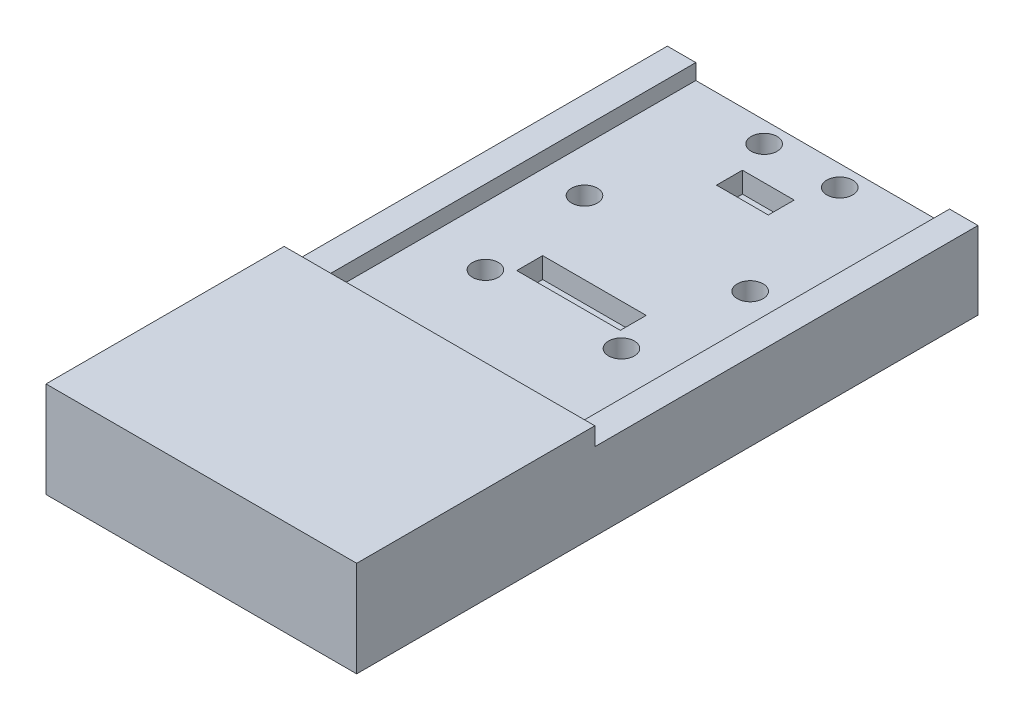
ISO-10303-21;
HEADER;
FILE_DESCRIPTION(('STEP AP214'),'2;1');
FILE_NAME('part.step','',(''),(''),'','','');
FILE_SCHEMA(('AUTOMOTIVE_DESIGN { 1 0 10303 214 1 1 1 1 }'));
ENDSEC;
DATA;
#1=APPLICATION_CONTEXT('core data for automotive mechanical design processes');
#2=APPLICATION_PROTOCOL_DEFINITION('international standard','automotive_design',2000,#1);
#3=PRODUCT_CONTEXT('',#1,'mechanical');
#4=PRODUCT('Part','Part','',(#3));
#5=PRODUCT_RELATED_PRODUCT_CATEGORY('part','',(#4));
#6=PRODUCT_DEFINITION_FORMATION('','',#4);
#7=PRODUCT_DEFINITION_CONTEXT('part definition',#1,'design');
#8=PRODUCT_DEFINITION('design','',#6,#7);
#9=PRODUCT_DEFINITION_SHAPE('','',#8);
#10=(LENGTH_UNIT() NAMED_UNIT(*) SI_UNIT(.MILLI.,.METRE.));
#11=(NAMED_UNIT(*) PLANE_ANGLE_UNIT() SI_UNIT($,.RADIAN.));
#12=(NAMED_UNIT(*) SI_UNIT($,.STERADIAN.) SOLID_ANGLE_UNIT());
#13=UNCERTAINTY_MEASURE_WITH_UNIT(LENGTH_MEASURE(1.E-05),#10,'distance_accuracy_value','');
#14=(GEOMETRIC_REPRESENTATION_CONTEXT(3) GLOBAL_UNCERTAINTY_ASSIGNED_CONTEXT((#13)) GLOBAL_UNIT_ASSIGNED_CONTEXT((#10,
#11,#12)) REPRESENTATION_CONTEXT('',''));
#15=CARTESIAN_POINT('',(0.,0.,0.));
#16=DIRECTION('',(0.,0.,1.));
#17=DIRECTION('',(1.,0.,0.));
#18=AXIS2_PLACEMENT_3D('',#15,#16,#17);
#19=CARTESIAN_POINT('',(0.,0.,0.));
#20=DIRECTION('',(0.,1.,0.));
#21=DIRECTION('',(0.,0.,1.));
#22=AXIS2_PLACEMENT_3D('',#19,#20,#21);
#23=PLANE('',#22);
#24=CARTESIAN_POINT('',(8.,0.,-15.));
#25=DIRECTION('',(0.,1.,0.));
#26=DIRECTION('',(0.,0.,1.));
#27=AXIS2_PLACEMENT_3D('',#24,#25,#26);
#28=CIRCLE('',#27,1.25);
#29=CARTESIAN_POINT('',(8.,0.,-13.75));
#30=VERTEX_POINT('',#29);
#31=EDGE_CURVE('E324',#30,#30,#28,.T.);
#32=ORIENTED_EDGE('',*,*,#31,.F.);
#33=EDGE_LOOP('',(#32));
#34=FACE_BOUND('',#33,.T.);
#35=CARTESIAN_POINT('',(-7.99999999999999,0.,-15.));
#36=DIRECTION('',(0.,1.,0.));
#37=DIRECTION('',(0.,0.,1.));
#38=AXIS2_PLACEMENT_3D('',#35,#36,#37);
#39=CIRCLE('',#38,1.25);
#40=CARTESIAN_POINT('',(-7.99999999999999,0.,-13.75));
#41=VERTEX_POINT('',#40);
#42=EDGE_CURVE('E327',#41,#41,#39,.T.);
#43=ORIENTED_EDGE('',*,*,#42,.F.);
#44=EDGE_LOOP('',(#43));
#45=FACE_BOUND('',#44,.T.);
#46=CARTESIAN_POINT('',(-3.65,0.,-28.));
#47=DIRECTION('',(0.,1.,0.));
#48=DIRECTION('',(0.,0.,1.));
#49=AXIS2_PLACEMENT_3D('',#46,#47,#48);
#50=CIRCLE('',#49,1.25);
#51=CARTESIAN_POINT('',(-3.65,0.,-26.75));
#52=VERTEX_POINT('',#51);
#53=EDGE_CURVE('E281',#52,#52,#50,.T.);
#54=ORIENTED_EDGE('',*,*,#53,.F.);
#55=EDGE_LOOP('',(#54));
#56=FACE_BOUND('',#55,.T.);
#57=CARTESIAN_POINT('',(3.65,0.,-28.));
#58=DIRECTION('',(0.,1.,0.));
#59=DIRECTION('',(0.,0.,1.));
#60=AXIS2_PLACEMENT_3D('',#57,#58,#59);
#61=CIRCLE('',#60,1.25);
#62=CARTESIAN_POINT('',(3.65,0.,-26.75));
#63=VERTEX_POINT('',#62);
#64=EDGE_CURVE('E271',#63,#63,#61,.T.);
#65=ORIENTED_EDGE('',*,*,#64,.F.);
#66=EDGE_LOOP('',(#65));
#67=FACE_BOUND('',#66,.T.);
#68=DIRECTION('',(0.,0.,1.));
#69=VECTOR('',#68,1.);
#70=CARTESIAN_POINT('',(-2.5,0.,-24.75));
#71=LINE('',#70,#69);
#72=CARTESIAN_POINT('',(-2.5,0.,-24.75));
#73=VERTEX_POINT('',#72);
#74=CARTESIAN_POINT('',(-2.5,0.,-22.25));
#75=VERTEX_POINT('',#74);
#76=EDGE_CURVE('E243',#73,#75,#71,.T.);
#77=ORIENTED_EDGE('',*,*,#76,.F.);
#78=DIRECTION('',(-1.,0.,0.));
#79=VECTOR('',#78,1.);
#80=CARTESIAN_POINT('',(-2.5,0.,-24.75));
#81=LINE('',#80,#79);
#82=CARTESIAN_POINT('',(2.5,0.,-24.75));
#83=VERTEX_POINT('',#82);
#84=EDGE_CURVE('E250',#83,#73,#81,.T.);
#85=ORIENTED_EDGE('',*,*,#84,.F.);
#86=DIRECTION('',(0.,0.,-1.));
#87=VECTOR('',#86,1.);
#88=CARTESIAN_POINT('',(2.5,0.,-24.75));
#89=LINE('',#88,#87);
#90=CARTESIAN_POINT('',(2.5,0.,-22.25));
#91=VERTEX_POINT('',#90);
#92=EDGE_CURVE('E264',#91,#83,#89,.T.);
#93=ORIENTED_EDGE('',*,*,#92,.F.);
#94=DIRECTION('',(1.,0.,0.));
#95=VECTOR('',#94,1.);
#96=CARTESIAN_POINT('',(-2.5,0.,-22.25));
#97=LINE('',#96,#95);
#98=EDGE_CURVE('E261',#75,#91,#97,.T.);
#99=ORIENTED_EDGE('',*,*,#98,.F.);
#100=EDGE_LOOP('',(#77,#85,#93,#99));
#101=FACE_BOUND('',#100,.T.);
#102=CARTESIAN_POINT('',(-6.57,0.,-4.));
#103=DIRECTION('',(0.,1.,0.));
#104=DIRECTION('',(0.,0.,1.));
#105=AXIS2_PLACEMENT_3D('',#102,#103,#104);
#106=CIRCLE('',#105,1.25);
#107=CARTESIAN_POINT('',(-6.57,0.,-2.75));
#108=VERTEX_POINT('',#107);
#109=EDGE_CURVE('E237',#108,#108,#106,.T.);
#110=ORIENTED_EDGE('',*,*,#109,.F.);
#111=EDGE_LOOP('',(#110));
#112=FACE_BOUND('',#111,.T.);
#113=CARTESIAN_POINT('',(6.57,0.,-4.));
#114=DIRECTION('',(0.,1.,0.));
#115=DIRECTION('',(0.,0.,1.));
#116=AXIS2_PLACEMENT_3D('',#113,#114,#115);
#117=CIRCLE('',#116,1.25);
#118=CARTESIAN_POINT('',(6.57,0.,-2.75));
#119=VERTEX_POINT('',#118);
#120=EDGE_CURVE('E227',#119,#119,#117,.T.);
#121=ORIENTED_EDGE('',*,*,#120,.F.);
#122=EDGE_LOOP('',(#121));
#123=FACE_BOUND('',#122,.T.);
#124=DIRECTION('',(0.,0.,1.));
#125=VECTOR('',#124,1.);
#126=CARTESIAN_POINT('',(-5.,0.,-7.95999999999999));
#127=LINE('',#126,#125);
#128=CARTESIAN_POINT('',(-5.,0.,-7.95999999999999));
#129=VERTEX_POINT('',#128);
#130=CARTESIAN_POINT('',(-5.,0.,-5.46));
#131=VERTEX_POINT('',#130);
#132=EDGE_CURVE('E201',#129,#131,#127,.T.);
#133=ORIENTED_EDGE('',*,*,#132,.F.);
#134=DIRECTION('',(-1.,0.,0.));
#135=VECTOR('',#134,1.);
#136=CARTESIAN_POINT('',(-5.,0.,-7.95999999999999));
#137=LINE('',#136,#135);
#138=CARTESIAN_POINT('',(5.,0.,-7.96));
#139=VERTEX_POINT('',#138);
#140=EDGE_CURVE('E206',#139,#129,#137,.T.);
#141=ORIENTED_EDGE('',*,*,#140,.F.);
#142=DIRECTION('',(0.,0.,-1.));
#143=VECTOR('',#142,1.);
#144=CARTESIAN_POINT('',(5.,0.,-7.96));
#145=LINE('',#144,#143);
#146=CARTESIAN_POINT('',(5.,0.,-5.46));
#147=VERTEX_POINT('',#146);
#148=EDGE_CURVE('E220',#147,#139,#145,.T.);
#149=ORIENTED_EDGE('',*,*,#148,.F.);
#150=DIRECTION('',(1.,0.,0.));
#151=VECTOR('',#150,1.);
#152=CARTESIAN_POINT('',(-5.,0.,-5.46));
#153=LINE('',#152,#151);
#154=EDGE_CURVE('E217',#131,#147,#153,.T.);
#155=ORIENTED_EDGE('',*,*,#154,.F.);
#156=EDGE_LOOP('',(#133,#141,#149,#155));
#157=FACE_BOUND('',#156,.T.);
#158=DIRECTION('',(0.,0.,-1.));
#159=VECTOR('',#158,1.);
#160=CARTESIAN_POINT('',(-12.25,0.,-30.));
#161=LINE('',#160,#159);
#162=CARTESIAN_POINT('',(-12.25,0.,7.));
#163=VERTEX_POINT('',#162);
#164=CARTESIAN_POINT('',(-12.25,0.,-30.));
#165=VERTEX_POINT('',#164);
#166=EDGE_CURVE('E37',#163,#165,#161,.T.);
#167=ORIENTED_EDGE('',*,*,#166,.F.);
#168=DIRECTION('',(-1.,0.,0.));
#169=VECTOR('',#168,1.);
#170=CARTESIAN_POINT('',(-15.,0.,7.));
#171=LINE('',#170,#169);
#172=CARTESIAN_POINT('',(12.25,0.,7.));
#173=VERTEX_POINT('',#172);
#174=EDGE_CURVE('E184',#173,#163,#171,.T.);
#175=ORIENTED_EDGE('',*,*,#174,.F.);
#176=DIRECTION('',(0.,0.,1.));
#177=VECTOR('',#176,1.);
#178=CARTESIAN_POINT('',(12.25,0.,-30.));
#179=LINE('',#178,#177);
#180=CARTESIAN_POINT('',(12.25,0.,-30.));
#181=VERTEX_POINT('',#180);
#182=EDGE_CURVE('E287',#181,#173,#179,.T.);
#183=ORIENTED_EDGE('',*,*,#182,.F.);
#184=DIRECTION('',(-1.,0.,0.));
#185=VECTOR('',#184,1.);
#186=CARTESIAN_POINT('',(-15.,0.,-30.));
#187=LINE('',#186,#185);
#188=EDGE_CURVE('E330',#181,#165,#187,.T.);
#189=ORIENTED_EDGE('',*,*,#188,.T.);
#190=EDGE_LOOP('',(#167,#175,#183,#189));
#191=FACE_BOUND('',#190,.T.);
#192=ADVANCED_FACE('F33',(#34,#45,#56,#67,#101,#112,#123,#157,#191),#23,.T.);
#193=CARTESIAN_POINT('',(-12.25,1.5,-30.));
#194=DIRECTION('',(-1.,0.,0.));
#195=DIRECTION('',(0.,0.,1.));
#196=AXIS2_PLACEMENT_3D('',#193,#194,#195);
#197=PLANE('',#196);
#198=DIRECTION('',(0.,1.,0.));
#199=VECTOR('',#198,1.);
#200=CARTESIAN_POINT('',(-12.25,1.5,7.));
#201=LINE('',#200,#199);
#202=CARTESIAN_POINT('',(-12.25,1.5,7.));
#203=VERTEX_POINT('',#202);
#204=EDGE_CURVE('E50',#163,#203,#201,.T.);
#205=ORIENTED_EDGE('',*,*,#204,.F.);
#206=ORIENTED_EDGE('',*,*,#166,.T.);
#207=DIRECTION('',(0.,-1.,0.));
#208=VECTOR('',#207,1.);
#209=CARTESIAN_POINT('',(-12.25,1.5,-30.));
#210=LINE('',#209,#208);
#211=CARTESIAN_POINT('',(-12.25,1.5,-30.));
#212=VERTEX_POINT('',#211);
#213=EDGE_CURVE('E307',#212,#165,#210,.T.);
#214=ORIENTED_EDGE('',*,*,#213,.F.);
#215=DIRECTION('',(0.,0.,-1.));
#216=VECTOR('',#215,1.);
#217=CARTESIAN_POINT('',(-12.25,1.5,-30.));
#218=LINE('',#217,#216);
#219=EDGE_CURVE('E303',#203,#212,#218,.T.);
#220=ORIENTED_EDGE('',*,*,#219,.F.);
#221=EDGE_LOOP('',(#205,#206,#214,#220));
#222=FACE_BOUND('',#221,.T.);
#223=ADVANCED_FACE('F374',(#222),#197,.F.);
#224=CARTESIAN_POINT('',(0.,1.5,0.));
#225=DIRECTION('',(0.,1.,0.));
#226=DIRECTION('',(0.,0.,1.));
#227=AXIS2_PLACEMENT_3D('',#224,#225,#226);
#228=PLANE('',#227);
#229=DIRECTION('',(0.,0.,1.));
#230=VECTOR('',#229,1.);
#231=CARTESIAN_POINT('',(-15.,1.5,-30.));
#232=LINE('',#231,#230);
#233=CARTESIAN_POINT('',(-15.,1.5,-30.));
#234=VERTEX_POINT('',#233);
#235=CARTESIAN_POINT('',(-15.,1.5,7.));
#236=VERTEX_POINT('',#235);
#237=EDGE_CURVE('E301',#234,#236,#232,.T.);
#238=ORIENTED_EDGE('',*,*,#237,.T.);
#239=DIRECTION('',(1.,0.,0.));
#240=VECTOR('',#239,1.);
#241=CARTESIAN_POINT('',(0.,1.5,7.));
#242=LINE('',#241,#240);
#243=EDGE_CURVE('E58',#236,#203,#242,.T.);
#244=ORIENTED_EDGE('',*,*,#243,.T.);
#245=ORIENTED_EDGE('',*,*,#219,.T.);
#246=DIRECTION('',(-1.,0.,0.));
#247=VECTOR('',#246,1.);
#248=CARTESIAN_POINT('',(-15.,1.5,-30.));
#249=LINE('',#248,#247);
#250=EDGE_CURVE('E305',#212,#234,#249,.T.);
#251=ORIENTED_EDGE('',*,*,#250,.T.);
#252=EDGE_LOOP('',(#238,#244,#245,#251));
#253=FACE_BOUND('',#252,.T.);
#254=ADVANCED_FACE('F364',(#253),#228,.T.);
#255=CARTESIAN_POINT('',(12.25,1.5,-30.));
#256=DIRECTION('',(1.,0.,0.));
#257=DIRECTION('',(0.,0.,-1.));
#258=AXIS2_PLACEMENT_3D('',#255,#256,#257);
#259=PLANE('',#258);
#260=DIRECTION('',(0.,-1.,0.));
#261=VECTOR('',#260,1.);
#262=CARTESIAN_POINT('',(12.25,1.5,7.));
#263=LINE('',#262,#261);
#264=CARTESIAN_POINT('',(12.25,1.5,7.));
#265=VERTEX_POINT('',#264);
#266=EDGE_CURVE('E196',#265,#173,#263,.T.);
#267=ORIENTED_EDGE('',*,*,#266,.F.);
#268=DIRECTION('',(0.,0.,1.));
#269=VECTOR('',#268,1.);
#270=CARTESIAN_POINT('',(12.25,1.5,-30.));
#271=LINE('',#270,#269);
#272=CARTESIAN_POINT('',(12.25,1.5,-30.));
#273=VERTEX_POINT('',#272);
#274=EDGE_CURVE('E294',#273,#265,#271,.T.);
#275=ORIENTED_EDGE('',*,*,#274,.F.);
#276=DIRECTION('',(0.,-1.,0.));
#277=VECTOR('',#276,1.);
#278=CARTESIAN_POINT('',(12.25,1.5,-30.));
#279=LINE('',#278,#277);
#280=EDGE_CURVE('E296',#273,#181,#279,.T.);
#281=ORIENTED_EDGE('',*,*,#280,.T.);
#282=ORIENTED_EDGE('',*,*,#182,.T.);
#283=EDGE_LOOP('',(#267,#275,#281,#282));
#284=FACE_BOUND('',#283,.T.);
#285=ADVANCED_FACE('F371',(#284),#259,.F.);
#286=CARTESIAN_POINT('',(0.,1.5,0.));
#287=DIRECTION('',(0.,-1.,0.));
#288=DIRECTION('',(0.,0.,-1.));
#289=AXIS2_PLACEMENT_3D('',#286,#287,#288);
#290=PLANE('',#289);
#291=DIRECTION('',(-1.,0.,0.));
#292=VECTOR('',#291,1.);
#293=CARTESIAN_POINT('',(0.,1.5,7.));
#294=LINE('',#293,#292);
#295=CARTESIAN_POINT('',(15.,1.5,7.));
#296=VERTEX_POINT('',#295);
#297=EDGE_CURVE('E11',#296,#265,#294,.T.);
#298=ORIENTED_EDGE('',*,*,#297,.F.);
#299=DIRECTION('',(0.,0.,-1.));
#300=VECTOR('',#299,1.);
#301=CARTESIAN_POINT('',(15.,1.5,-30.));
#302=LINE('',#301,#300);
#303=CARTESIAN_POINT('',(15.,1.5,-30.));
#304=VERTEX_POINT('',#303);
#305=EDGE_CURVE('E290',#296,#304,#302,.T.);
#306=ORIENTED_EDGE('',*,*,#305,.T.);
#307=DIRECTION('',(-1.,0.,0.));
#308=VECTOR('',#307,1.);
#309=CARTESIAN_POINT('',(15.,1.5,-30.));
#310=LINE('',#309,#308);
#311=EDGE_CURVE('E292',#304,#273,#310,.T.);
#312=ORIENTED_EDGE('',*,*,#311,.T.);
#313=ORIENTED_EDGE('',*,*,#274,.T.);
#314=EDGE_LOOP('',(#298,#306,#312,#313));
#315=FACE_BOUND('',#314,.T.);
#316=ADVANCED_FACE('F411',(#315),#290,.F.);
#317=CARTESIAN_POINT('',(-7.99999999999999,-6.,-15.));
#318=DIRECTION('',(0.,1.,0.));
#319=DIRECTION('',(0.,0.,1.));
#320=AXIS2_PLACEMENT_3D('',#317,#318,#319);
#321=CYLINDRICAL_SURFACE('',#320,1.25);
#322=ORIENTED_EDGE('',*,*,#42,.T.);
#323=EDGE_LOOP('',(#322));
#324=FACE_BOUND('',#323,.T.);
#325=CARTESIAN_POINT('',(-7.99999999999999,-4.,-15.));
#326=DIRECTION('',(0.,-1.,0.));
#327=DIRECTION('',(0.,0.,-1.));
#328=AXIS2_PLACEMENT_3D('',#325,#326,#327);
#329=CIRCLE('',#328,1.25);
#330=CARTESIAN_POINT('',(-7.99999999999999,-4.,-16.25));
#331=VERTEX_POINT('',#330);
#332=EDGE_CURVE('E313',#331,#331,#329,.F.);
#333=ORIENTED_EDGE('',*,*,#332,.F.);
#334=EDGE_LOOP('',(#333));
#335=FACE_BOUND('',#334,.T.);
#336=ADVANCED_FACE('F407',(#324,#335),#321,.F.);
#337=CARTESIAN_POINT('',(8.,-6.,-15.));
#338=DIRECTION('',(0.,1.,0.));
#339=DIRECTION('',(0.,0.,1.));
#340=AXIS2_PLACEMENT_3D('',#337,#338,#339);
#341=CYLINDRICAL_SURFACE('',#340,1.25);
#342=ORIENTED_EDGE('',*,*,#31,.T.);
#343=EDGE_LOOP('',(#342));
#344=FACE_BOUND('',#343,.T.);
#345=CARTESIAN_POINT('',(8.,-4.,-15.));
#346=DIRECTION('',(0.,-1.,0.));
#347=DIRECTION('',(0.,0.,-1.));
#348=AXIS2_PLACEMENT_3D('',#345,#346,#347);
#349=CIRCLE('',#348,1.25);
#350=CARTESIAN_POINT('',(8.,-4.,-16.25));
#351=VERTEX_POINT('',#350);
#352=EDGE_CURVE('E320',#351,#351,#349,.F.);
#353=ORIENTED_EDGE('',*,*,#352,.F.);
#354=EDGE_LOOP('',(#353));
#355=FACE_BOUND('',#354,.T.);
#356=ADVANCED_FACE('F404',(#344,#355),#341,.F.);
#357=CARTESIAN_POINT('',(-15.,-6.,-30.));
#358=DIRECTION('',(-1.,0.,0.));
#359=DIRECTION('',(0.,0.,1.));
#360=AXIS2_PLACEMENT_3D('',#357,#358,#359);
#361=PLANE('',#360);
#362=DIRECTION('',(0.,-1.,0.));
#363=VECTOR('',#362,1.);
#364=CARTESIAN_POINT('',(-15.,3.25,7.));
#365=LINE('',#364,#363);
#366=CARTESIAN_POINT('',(-15.,3.25,7.));
#367=VERTEX_POINT('',#366);
#368=EDGE_CURVE('E190',#367,#236,#365,.T.);
#369=ORIENTED_EDGE('',*,*,#368,.T.);
#370=ORIENTED_EDGE('',*,*,#237,.F.);
#371=DIRECTION('',(0.,1.,0.));
#372=VECTOR('',#371,1.);
#373=CARTESIAN_POINT('',(-15.,-6.,-30.));
#374=LINE('',#373,#372);
#375=CARTESIAN_POINT('',(-15.,-6.,-30.));
#376=VERTEX_POINT('',#375);
#377=EDGE_CURVE('E43',#376,#234,#374,.T.);
#378=ORIENTED_EDGE('',*,*,#377,.F.);
#379=DIRECTION('',(0.,0.,1.));
#380=VECTOR('',#379,1.);
#381=CARTESIAN_POINT('',(-15.,-6.,-30.));
#382=LINE('',#381,#380);
#383=CARTESIAN_POINT('',(-15.,-6.,30.));
#384=VERTEX_POINT('',#383);
#385=EDGE_CURVE('E166',#376,#384,#382,.T.);
#386=ORIENTED_EDGE('',*,*,#385,.T.);
#387=DIRECTION('',(0.,1.,0.));
#388=VECTOR('',#387,1.);
#389=CARTESIAN_POINT('',(-15.,-6.,30.));
#390=LINE('',#389,#388);
#391=CARTESIAN_POINT('',(-15.,3.25,30.));
#392=VERTEX_POINT('',#391);
#393=EDGE_CURVE('E160',#384,#392,#390,.T.);
#394=ORIENTED_EDGE('',*,*,#393,.T.);
#395=DIRECTION('',(0.,0.,1.));
#396=VECTOR('',#395,1.);
#397=CARTESIAN_POINT('',(-15.,3.25,7.));
#398=LINE('',#397,#396);
#399=EDGE_CURVE('E164',#367,#392,#398,.T.);
#400=ORIENTED_EDGE('',*,*,#399,.F.);
#401=EDGE_LOOP('',(#369,#370,#378,#386,#394,#400));
#402=FACE_BOUND('',#401,.T.);
#403=ADVANCED_FACE('F35',(#402),#361,.T.);
#404=CARTESIAN_POINT('',(-15.,-6.,-30.));
#405=DIRECTION('',(0.,0.,-1.));
#406=DIRECTION('',(-1.,0.,0.));
#407=AXIS2_PLACEMENT_3D('',#404,#405,#406);
#408=PLANE('',#407);
#409=ORIENTED_EDGE('',*,*,#188,.F.);
#410=ORIENTED_EDGE('',*,*,#280,.F.);
#411=ORIENTED_EDGE('',*,*,#311,.F.);
#412=DIRECTION('',(0.,1.,0.));
#413=VECTOR('',#412,1.);
#414=CARTESIAN_POINT('',(15.,-6.,-30.));
#415=LINE('',#414,#413);
#416=CARTESIAN_POINT('',(15.,-6.,-30.));
#417=VERTEX_POINT('',#416);
#418=EDGE_CURVE('E353',#417,#304,#415,.T.);
#419=ORIENTED_EDGE('',*,*,#418,.F.);
#420=DIRECTION('',(-1.,0.,0.));
#421=VECTOR('',#420,1.);
#422=CARTESIAN_POINT('',(-15.,-6.,-30.));
#423=LINE('',#422,#421);
#424=EDGE_CURVE('E171',#417,#376,#423,.T.);
#425=ORIENTED_EDGE('',*,*,#424,.T.);
#426=ORIENTED_EDGE('',*,*,#377,.T.);
#427=ORIENTED_EDGE('',*,*,#250,.F.);
#428=ORIENTED_EDGE('',*,*,#213,.T.);
#429=EDGE_LOOP('',(#409,#410,#411,#419,#425,#426,#427,#428));
#430=FACE_BOUND('',#429,.T.);
#431=ADVANCED_FACE('F361',(#430),#408,.T.);
#432=CARTESIAN_POINT('',(15.,-6.,-30.));
#433=DIRECTION('',(1.,0.,0.));
#434=DIRECTION('',(0.,0.,-1.));
#435=AXIS2_PLACEMENT_3D('',#432,#433,#434);
#436=PLANE('',#435);
#437=ORIENTED_EDGE('',*,*,#305,.F.);
#438=DIRECTION('',(0.,-1.,0.));
#439=VECTOR('',#438,1.);
#440=CARTESIAN_POINT('',(15.,3.25,7.));
#441=LINE('',#440,#439);
#442=CARTESIAN_POINT('',(15.,3.25,7.));
#443=VERTEX_POINT('',#442);
#444=EDGE_CURVE('E193',#443,#296,#441,.T.);
#445=ORIENTED_EDGE('',*,*,#444,.F.);
#446=DIRECTION('',(0.,0.,-1.));
#447=VECTOR('',#446,1.);
#448=CARTESIAN_POINT('',(15.,3.25,7.));
#449=LINE('',#448,#447);
#450=CARTESIAN_POINT('',(15.,3.25,30.));
#451=VERTEX_POINT('',#450);
#452=EDGE_CURVE('E178',#451,#443,#449,.T.);
#453=ORIENTED_EDGE('',*,*,#452,.F.);
#454=DIRECTION('',(0.,1.,0.));
#455=VECTOR('',#454,1.);
#456=CARTESIAN_POINT('',(15.,-6.,30.));
#457=LINE('',#456,#455);
#458=CARTESIAN_POINT('',(15.,-6.,30.));
#459=VERTEX_POINT('',#458);
#460=EDGE_CURVE('E170',#459,#451,#457,.T.);
#461=ORIENTED_EDGE('',*,*,#460,.F.);
#462=DIRECTION('',(0.,0.,-1.));
#463=VECTOR('',#462,1.);
#464=CARTESIAN_POINT('',(15.,-6.,-30.));
#465=LINE('',#464,#463);
#466=EDGE_CURVE('E334',#459,#417,#465,.T.);
#467=ORIENTED_EDGE('',*,*,#466,.T.);
#468=ORIENTED_EDGE('',*,*,#418,.T.);
#469=EDGE_LOOP('',(#437,#445,#453,#461,#467,#468));
#470=FACE_BOUND('',#469,.T.);
#471=ADVANCED_FACE('F418',(#470),#436,.T.);
#472=CARTESIAN_POINT('',(-15.,-6.,30.));
#473=DIRECTION('',(0.,0.,1.));
#474=DIRECTION('',(1.,0.,0.));
#475=AXIS2_PLACEMENT_3D('',#472,#473,#474);
#476=PLANE('',#475);
#477=ORIENTED_EDGE('',*,*,#460,.T.);
#478=DIRECTION('',(1.,0.,0.));
#479=VECTOR('',#478,1.);
#480=CARTESIAN_POINT('',(-15.,3.25,30.));
#481=LINE('',#480,#479);
#482=EDGE_CURVE('E174',#392,#451,#481,.T.);
#483=ORIENTED_EDGE('',*,*,#482,.F.);
#484=ORIENTED_EDGE('',*,*,#393,.F.);
#485=DIRECTION('',(1.,0.,0.));
#486=VECTOR('',#485,1.);
#487=CARTESIAN_POINT('',(-15.,-6.,30.));
#488=LINE('',#487,#486);
#489=EDGE_CURVE('E332',#384,#459,#488,.T.);
#490=ORIENTED_EDGE('',*,*,#489,.T.);
#491=EDGE_LOOP('',(#477,#483,#484,#490));
#492=FACE_BOUND('',#491,.T.);
#493=ADVANCED_FACE('F175',(#492),#476,.T.);
#494=CARTESIAN_POINT('',(0.,-6.,0.));
#495=DIRECTION('',(0.,1.,0.));
#496=DIRECTION('',(0.,0.,1.));
#497=AXIS2_PLACEMENT_3D('',#494,#495,#496);
#498=PLANE('',#497);
#499=CARTESIAN_POINT('',(-7.99999999999999,-6.,-15.));
#500=DIRECTION('',(0.,-1.,0.));
#501=DIRECTION('',(0.,0.,-1.));
#502=AXIS2_PLACEMENT_3D('',#499,#500,#501);
#503=CIRCLE('',#502,2.25);
#504=CARTESIAN_POINT('',(-7.99999999999999,-6.,-17.25));
#505=VERTEX_POINT('',#504);
#506=EDGE_CURVE('E314',#505,#505,#503,.T.);
#507=ORIENTED_EDGE('',*,*,#506,.F.);
#508=EDGE_LOOP('',(#507));
#509=FACE_BOUND('',#508,.T.);
#510=CARTESIAN_POINT('',(8.,-6.,-15.));
#511=DIRECTION('',(0.,-1.,0.));
#512=DIRECTION('',(0.,0.,-1.));
#513=AXIS2_PLACEMENT_3D('',#510,#511,#512);
#514=CIRCLE('',#513,2.25);
#515=CARTESIAN_POINT('',(8.,-6.,-17.25));
#516=VERTEX_POINT('',#515);
#517=EDGE_CURVE('E321',#516,#516,#514,.T.);
#518=ORIENTED_EDGE('',*,*,#517,.F.);
#519=EDGE_LOOP('',(#518));
#520=FACE_BOUND('',#519,.T.);
#521=ORIENTED_EDGE('',*,*,#385,.F.);
#522=ORIENTED_EDGE('',*,*,#424,.F.);
#523=ORIENTED_EDGE('',*,*,#466,.F.);
#524=ORIENTED_EDGE('',*,*,#489,.F.);
#525=EDGE_LOOP('',(#521,#522,#523,#524));
#526=FACE_BOUND('',#525,.T.);
#527=ADVANCED_FACE('F399',(#509,#520,#526),#498,.F.);
#528=CARTESIAN_POINT('',(8.,-4.,-15.));
#529=DIRECTION('',(0.,-1.,0.));
#530=DIRECTION('',(0.,0.,-1.));
#531=AXIS2_PLACEMENT_3D('',#528,#529,#530);
#532=PLANE('',#531);
#533=CARTESIAN_POINT('',(8.,-4.,-15.));
#534=DIRECTION('',(0.,-1.,0.));
#535=DIRECTION('',(0.,0.,-1.));
#536=AXIS2_PLACEMENT_3D('',#533,#534,#535);
#537=CIRCLE('',#536,2.25);
#538=CARTESIAN_POINT('',(8.,-4.,-17.25));
#539=VERTEX_POINT('',#538);
#540=EDGE_CURVE('E317',#539,#539,#537,.T.);
#541=ORIENTED_EDGE('',*,*,#540,.T.);
#542=EDGE_LOOP('',(#541));
#543=FACE_BOUND('',#542,.T.);
#544=ORIENTED_EDGE('',*,*,#352,.T.);
#545=EDGE_LOOP('',(#544));
#546=FACE_BOUND('',#545,.T.);
#547=ADVANCED_FACE('F396',(#543,#546),#532,.T.);
#548=CARTESIAN_POINT('',(8.,-4.,-15.));
#549=DIRECTION('',(0.,-1.,0.));
#550=DIRECTION('',(0.,0.,-1.));
#551=AXIS2_PLACEMENT_3D('',#548,#549,#550);
#552=CYLINDRICAL_SURFACE('',#551,2.25);
#553=ORIENTED_EDGE('',*,*,#540,.F.);
#554=EDGE_LOOP('',(#553));
#555=FACE_BOUND('',#554,.T.);
#556=ORIENTED_EDGE('',*,*,#517,.T.);
#557=EDGE_LOOP('',(#556));
#558=FACE_BOUND('',#557,.T.);
#559=ADVANCED_FACE('F390',(#555,#558),#552,.F.);
#560=CARTESIAN_POINT('',(-7.99999999999999,-4.,-15.));
#561=DIRECTION('',(0.,-1.,0.));
#562=DIRECTION('',(0.,0.,-1.));
#563=AXIS2_PLACEMENT_3D('',#560,#561,#562);
#564=PLANE('',#563);
#565=CARTESIAN_POINT('',(-7.99999999999999,-4.,-15.));
#566=DIRECTION('',(0.,-1.,0.));
#567=DIRECTION('',(0.,0.,-1.));
#568=AXIS2_PLACEMENT_3D('',#565,#566,#567);
#569=CIRCLE('',#568,2.25);
#570=CARTESIAN_POINT('',(-7.99999999999999,-4.,-17.25));
#571=VERTEX_POINT('',#570);
#572=EDGE_CURVE('E310',#571,#571,#569,.T.);
#573=ORIENTED_EDGE('',*,*,#572,.T.);
#574=EDGE_LOOP('',(#573));
#575=FACE_BOUND('',#574,.T.);
#576=ORIENTED_EDGE('',*,*,#332,.T.);
#577=EDGE_LOOP('',(#576));
#578=FACE_BOUND('',#577,.T.);
#579=ADVANCED_FACE('F386',(#575,#578),#564,.T.);
#580=CARTESIAN_POINT('',(-7.99999999999999,-4.,-15.));
#581=DIRECTION('',(0.,-1.,0.));
#582=DIRECTION('',(0.,0.,-1.));
#583=AXIS2_PLACEMENT_3D('',#580,#581,#582);
#584=CYLINDRICAL_SURFACE('',#583,2.25);
#585=ORIENTED_EDGE('',*,*,#572,.F.);
#586=EDGE_LOOP('',(#585));
#587=FACE_BOUND('',#586,.T.);
#588=ORIENTED_EDGE('',*,*,#506,.T.);
#589=EDGE_LOOP('',(#588));
#590=FACE_BOUND('',#589,.T.);
#591=ADVANCED_FACE('F389',(#587,#590),#584,.F.);
#592=CARTESIAN_POINT('',(-3.65,-2.,-28.));
#593=DIRECTION('',(0.,1.,0.));
#594=DIRECTION('',(0.,0.,1.));
#595=AXIS2_PLACEMENT_3D('',#592,#593,#594);
#596=CYLINDRICAL_SURFACE('',#595,1.25);
#597=CARTESIAN_POINT('',(-3.65,-2.,-28.));
#598=DIRECTION('',(0.,1.,0.));
#599=DIRECTION('',(0.,0.,1.));
#600=AXIS2_PLACEMENT_3D('',#597,#598,#599);
#601=CIRCLE('',#600,1.25);
#602=CARTESIAN_POINT('',(-3.65,-2.,-26.75));
#603=VERTEX_POINT('',#602);
#604=EDGE_CURVE('E284',#603,#603,#601,.T.);
#605=ORIENTED_EDGE('',*,*,#604,.F.);
#606=EDGE_LOOP('',(#605));
#607=FACE_BOUND('',#606,.T.);
#608=ORIENTED_EDGE('',*,*,#53,.T.);
#609=EDGE_LOOP('',(#608));
#610=FACE_BOUND('',#609,.T.);
#611=ADVANCED_FACE('F394',(#607,#610),#596,.F.);
#612=CARTESIAN_POINT('',(-3.65,-2.,-28.));
#613=DIRECTION('',(0.,1.,0.));
#614=DIRECTION('',(0.,0.,1.));
#615=AXIS2_PLACEMENT_3D('',#612,#613,#614);
#616=PLANE('',#615);
#617=ORIENTED_EDGE('',*,*,#604,.T.);
#618=EDGE_LOOP('',(#617));
#619=FACE_BOUND('',#618,.T.);
#620=ADVANCED_FACE('F454',(#619),#616,.T.);
#621=CARTESIAN_POINT('',(3.65,-2.,-28.));
#622=DIRECTION('',(0.,1.,0.));
#623=DIRECTION('',(0.,0.,1.));
#624=AXIS2_PLACEMENT_3D('',#621,#622,#623);
#625=CYLINDRICAL_SURFACE('',#624,1.25);
#626=CARTESIAN_POINT('',(3.65,-2.,-28.));
#627=DIRECTION('',(0.,1.,0.));
#628=DIRECTION('',(0.,0.,1.));
#629=AXIS2_PLACEMENT_3D('',#626,#627,#628);
#630=CIRCLE('',#629,1.25);
#631=CARTESIAN_POINT('',(3.65,-2.,-26.75));
#632=VERTEX_POINT('',#631);
#633=EDGE_CURVE('E278',#632,#632,#630,.T.);
#634=ORIENTED_EDGE('',*,*,#633,.F.);
#635=EDGE_LOOP('',(#634));
#636=FACE_BOUND('',#635,.T.);
#637=ORIENTED_EDGE('',*,*,#64,.T.);
#638=EDGE_LOOP('',(#637));
#639=FACE_BOUND('',#638,.T.);
#640=ADVANCED_FACE('F462',(#636,#639),#625,.F.);
#641=CARTESIAN_POINT('',(3.65,-2.,-28.));
#642=DIRECTION('',(0.,1.,0.));
#643=DIRECTION('',(0.,0.,1.));
#644=AXIS2_PLACEMENT_3D('',#641,#642,#643);
#645=PLANE('',#644);
#646=ORIENTED_EDGE('',*,*,#633,.T.);
#647=EDGE_LOOP('',(#646));
#648=FACE_BOUND('',#647,.T.);
#649=ADVANCED_FACE('F470',(#648),#645,.T.);
#650=CARTESIAN_POINT('',(-2.5,-2.,-24.75));
#651=DIRECTION('',(-1.,0.,0.));
#652=DIRECTION('',(0.,0.,1.));
#653=AXIS2_PLACEMENT_3D('',#650,#651,#652);
#654=PLANE('',#653);
#655=ORIENTED_EDGE('',*,*,#76,.T.);
#656=DIRECTION('',(0.,1.,0.));
#657=VECTOR('',#656,1.);
#658=CARTESIAN_POINT('',(-2.5,-2.,-22.25));
#659=LINE('',#658,#657);
#660=CARTESIAN_POINT('',(-2.5,-2.,-22.25));
#661=VERTEX_POINT('',#660);
#662=EDGE_CURVE('E259',#661,#75,#659,.T.);
#663=ORIENTED_EDGE('',*,*,#662,.F.);
#664=DIRECTION('',(0.,0.,1.));
#665=VECTOR('',#664,1.);
#666=CARTESIAN_POINT('',(-2.5,-2.,-24.75));
#667=LINE('',#666,#665);
#668=CARTESIAN_POINT('',(-2.5,-2.,-24.75));
#669=VERTEX_POINT('',#668);
#670=EDGE_CURVE('E246',#669,#661,#667,.T.);
#671=ORIENTED_EDGE('',*,*,#670,.F.);
#672=DIRECTION('',(0.,1.,0.));
#673=VECTOR('',#672,1.);
#674=CARTESIAN_POINT('',(-2.5,-2.,-24.75));
#675=LINE('',#674,#673);
#676=EDGE_CURVE('E269',#669,#73,#675,.T.);
#677=ORIENTED_EDGE('',*,*,#676,.T.);
#678=EDGE_LOOP('',(#655,#663,#671,#677));
#679=FACE_BOUND('',#678,.T.);
#680=ADVANCED_FACE('F478',(#679),#654,.F.);
#681=CARTESIAN_POINT('',(-2.5,-2.,-24.75));
#682=DIRECTION('',(0.,0.,-1.));
#683=DIRECTION('',(-1.,0.,0.));
#684=AXIS2_PLACEMENT_3D('',#681,#682,#683);
#685=PLANE('',#684);
#686=ORIENTED_EDGE('',*,*,#84,.T.);
#687=ORIENTED_EDGE('',*,*,#676,.F.);
#688=DIRECTION('',(-1.,0.,0.));
#689=VECTOR('',#688,1.);
#690=CARTESIAN_POINT('',(-2.5,-2.,-24.75));
#691=LINE('',#690,#689);
#692=CARTESIAN_POINT('',(2.5,-2.,-24.75));
#693=VERTEX_POINT('',#692);
#694=EDGE_CURVE('E256',#693,#669,#691,.T.);
#695=ORIENTED_EDGE('',*,*,#694,.F.);
#696=DIRECTION('',(0.,1.,0.));
#697=VECTOR('',#696,1.);
#698=CARTESIAN_POINT('',(2.5,-2.,-24.75));
#699=LINE('',#698,#697);
#700=EDGE_CURVE('E272',#693,#83,#699,.T.);
#701=ORIENTED_EDGE('',*,*,#700,.T.);
#702=EDGE_LOOP('',(#686,#687,#695,#701));
#703=FACE_BOUND('',#702,.T.);
#704=ADVANCED_FACE('F486',(#703),#685,.F.);
#705=CARTESIAN_POINT('',(2.5,-2.,-24.75));
#706=DIRECTION('',(1.,0.,0.));
#707=DIRECTION('',(0.,0.,-1.));
#708=AXIS2_PLACEMENT_3D('',#705,#706,#707);
#709=PLANE('',#708);
#710=ORIENTED_EDGE('',*,*,#92,.T.);
#711=ORIENTED_EDGE('',*,*,#700,.F.);
#712=DIRECTION('',(0.,0.,-1.));
#713=VECTOR('',#712,1.);
#714=CARTESIAN_POINT('',(2.5,-2.,-24.75));
#715=LINE('',#714,#713);
#716=CARTESIAN_POINT('',(2.5,-2.,-22.25));
#717=VERTEX_POINT('',#716);
#718=EDGE_CURVE('E253',#717,#693,#715,.T.);
#719=ORIENTED_EDGE('',*,*,#718,.F.);
#720=DIRECTION('',(0.,1.,0.));
#721=VECTOR('',#720,1.);
#722=CARTESIAN_POINT('',(2.5,-2.,-22.25));
#723=LINE('',#722,#721);
#724=EDGE_CURVE('E274',#717,#91,#723,.T.);
#725=ORIENTED_EDGE('',*,*,#724,.T.);
#726=EDGE_LOOP('',(#710,#711,#719,#725));
#727=FACE_BOUND('',#726,.T.);
#728=ADVANCED_FACE('F494',(#727),#709,.F.);
#729=CARTESIAN_POINT('',(-2.5,-2.,-22.25));
#730=DIRECTION('',(0.,0.,1.));
#731=DIRECTION('',(1.,0.,0.));
#732=AXIS2_PLACEMENT_3D('',#729,#730,#731);
#733=PLANE('',#732);
#734=ORIENTED_EDGE('',*,*,#98,.T.);
#735=ORIENTED_EDGE('',*,*,#724,.F.);
#736=DIRECTION('',(1.,0.,0.));
#737=VECTOR('',#736,1.);
#738=CARTESIAN_POINT('',(-2.5,-2.,-22.25));
#739=LINE('',#738,#737);
#740=EDGE_CURVE('E249',#661,#717,#739,.T.);
#741=ORIENTED_EDGE('',*,*,#740,.F.);
#742=ORIENTED_EDGE('',*,*,#662,.T.);
#743=EDGE_LOOP('',(#734,#735,#741,#742));
#744=FACE_BOUND('',#743,.T.);
#745=ADVANCED_FACE('F502',(#744),#733,.F.);
#746=CARTESIAN_POINT('',(0.,-2.,0.));
#747=DIRECTION('',(0.,1.,0.));
#748=DIRECTION('',(0.,0.,1.));
#749=AXIS2_PLACEMENT_3D('',#746,#747,#748);
#750=PLANE('',#749);
#751=ORIENTED_EDGE('',*,*,#670,.T.);
#752=ORIENTED_EDGE('',*,*,#740,.T.);
#753=ORIENTED_EDGE('',*,*,#718,.T.);
#754=ORIENTED_EDGE('',*,*,#694,.T.);
#755=EDGE_LOOP('',(#751,#752,#753,#754));
#756=FACE_BOUND('',#755,.T.);
#757=ADVANCED_FACE('F510',(#756),#750,.T.);
#758=CARTESIAN_POINT('',(-6.57,-2.,-4.));
#759=DIRECTION('',(0.,1.,0.));
#760=DIRECTION('',(0.,0.,1.));
#761=AXIS2_PLACEMENT_3D('',#758,#759,#760);
#762=CYLINDRICAL_SURFACE('',#761,1.25);
#763=CARTESIAN_POINT('',(-6.57,-2.,-4.));
#764=DIRECTION('',(0.,1.,0.));
#765=DIRECTION('',(0.,0.,1.));
#766=AXIS2_PLACEMENT_3D('',#763,#764,#765);
#767=CIRCLE('',#766,1.25);
#768=CARTESIAN_POINT('',(-6.57,-2.,-2.75));
#769=VERTEX_POINT('',#768);
#770=EDGE_CURVE('E240',#769,#769,#767,.T.);
#771=ORIENTED_EDGE('',*,*,#770,.F.);
#772=EDGE_LOOP('',(#771));
#773=FACE_BOUND('',#772,.T.);
#774=ORIENTED_EDGE('',*,*,#109,.T.);
#775=EDGE_LOOP('',(#774));
#776=FACE_BOUND('',#775,.T.);
#777=ADVANCED_FACE('F518',(#773,#776),#762,.F.);
#778=CARTESIAN_POINT('',(-6.57,-2.,-4.));
#779=DIRECTION('',(0.,1.,0.));
#780=DIRECTION('',(0.,0.,1.));
#781=AXIS2_PLACEMENT_3D('',#778,#779,#780);
#782=PLANE('',#781);
#783=ORIENTED_EDGE('',*,*,#770,.T.);
#784=EDGE_LOOP('',(#783));
#785=FACE_BOUND('',#784,.T.);
#786=ADVANCED_FACE('F526',(#785),#782,.T.);
#787=CARTESIAN_POINT('',(6.57,-2.,-4.));
#788=DIRECTION('',(0.,1.,0.));
#789=DIRECTION('',(0.,0.,1.));
#790=AXIS2_PLACEMENT_3D('',#787,#788,#789);
#791=CYLINDRICAL_SURFACE('',#790,1.25);
#792=CARTESIAN_POINT('',(6.57,-2.,-4.));
#793=DIRECTION('',(0.,1.,0.));
#794=DIRECTION('',(0.,0.,1.));
#795=AXIS2_PLACEMENT_3D('',#792,#793,#794);
#796=CIRCLE('',#795,1.25);
#797=CARTESIAN_POINT('',(6.57,-2.,-2.75));
#798=VERTEX_POINT('',#797);
#799=EDGE_CURVE('E234',#798,#798,#796,.T.);
#800=ORIENTED_EDGE('',*,*,#799,.F.);
#801=EDGE_LOOP('',(#800));
#802=FACE_BOUND('',#801,.T.);
#803=ORIENTED_EDGE('',*,*,#120,.T.);
#804=EDGE_LOOP('',(#803));
#805=FACE_BOUND('',#804,.T.);
#806=ADVANCED_FACE('F534',(#802,#805),#791,.F.);
#807=CARTESIAN_POINT('',(6.57,-2.,-4.));
#808=DIRECTION('',(0.,1.,0.));
#809=DIRECTION('',(0.,0.,1.));
#810=AXIS2_PLACEMENT_3D('',#807,#808,#809);
#811=PLANE('',#810);
#812=ORIENTED_EDGE('',*,*,#799,.T.);
#813=EDGE_LOOP('',(#812));
#814=FACE_BOUND('',#813,.T.);
#815=ADVANCED_FACE('F542',(#814),#811,.T.);
#816=CARTESIAN_POINT('',(-5.,-2.,-7.95999999999999));
#817=DIRECTION('',(-1.,0.,0.));
#818=DIRECTION('',(0.,0.,1.));
#819=AXIS2_PLACEMENT_3D('',#816,#817,#818);
#820=PLANE('',#819);
#821=ORIENTED_EDGE('',*,*,#132,.T.);
#822=DIRECTION('',(0.,1.,0.));
#823=VECTOR('',#822,1.);
#824=CARTESIAN_POINT('',(-5.,-2.,-5.46));
#825=LINE('',#824,#823);
#826=CARTESIAN_POINT('',(-5.,-2.,-5.46));
#827=VERTEX_POINT('',#826);
#828=EDGE_CURVE('E215',#827,#131,#825,.T.);
#829=ORIENTED_EDGE('',*,*,#828,.F.);
#830=DIRECTION('',(0.,0.,1.));
#831=VECTOR('',#830,1.);
#832=CARTESIAN_POINT('',(-5.,-2.,-7.95999999999999));
#833=LINE('',#832,#831);
#834=CARTESIAN_POINT('',(-5.,-2.,-7.95999999999999));
#835=VERTEX_POINT('',#834);
#836=EDGE_CURVE('E202',#835,#827,#833,.T.);
#837=ORIENTED_EDGE('',*,*,#836,.F.);
#838=DIRECTION('',(0.,1.,0.));
#839=VECTOR('',#838,1.);
#840=CARTESIAN_POINT('',(-5.,-2.,-7.95999999999999));
#841=LINE('',#840,#839);
#842=EDGE_CURVE('E225',#835,#129,#841,.T.);
#843=ORIENTED_EDGE('',*,*,#842,.T.);
#844=EDGE_LOOP('',(#821,#829,#837,#843));
#845=FACE_BOUND('',#844,.T.);
#846=ADVANCED_FACE('F550',(#845),#820,.F.);
#847=CARTESIAN_POINT('',(-5.,-2.,-7.95999999999999));
#848=DIRECTION('',(0.,0.,-1.));
#849=DIRECTION('',(-1.,0.,0.));
#850=AXIS2_PLACEMENT_3D('',#847,#848,#849);
#851=PLANE('',#850);
#852=ORIENTED_EDGE('',*,*,#140,.T.);
#853=ORIENTED_EDGE('',*,*,#842,.F.);
#854=DIRECTION('',(-1.,0.,0.));
#855=VECTOR('',#854,1.);
#856=CARTESIAN_POINT('',(-5.,-2.,-7.95999999999999));
#857=LINE('',#856,#855);
#858=CARTESIAN_POINT('',(5.,-2.,-7.96));
#859=VERTEX_POINT('',#858);
#860=EDGE_CURVE('E212',#859,#835,#857,.T.);
#861=ORIENTED_EDGE('',*,*,#860,.F.);
#862=DIRECTION('',(0.,1.,0.));
#863=VECTOR('',#862,1.);
#864=CARTESIAN_POINT('',(5.,-2.,-7.96));
#865=LINE('',#864,#863);
#866=EDGE_CURVE('E228',#859,#139,#865,.T.);
#867=ORIENTED_EDGE('',*,*,#866,.T.);
#868=EDGE_LOOP('',(#852,#853,#861,#867));
#869=FACE_BOUND('',#868,.T.);
#870=ADVANCED_FACE('F558',(#869),#851,.F.);
#871=CARTESIAN_POINT('',(5.,-2.,-7.96));
#872=DIRECTION('',(1.,0.,0.));
#873=DIRECTION('',(0.,0.,-1.));
#874=AXIS2_PLACEMENT_3D('',#871,#872,#873);
#875=PLANE('',#874);
#876=ORIENTED_EDGE('',*,*,#148,.T.);
#877=ORIENTED_EDGE('',*,*,#866,.F.);
#878=DIRECTION('',(0.,0.,-1.));
#879=VECTOR('',#878,1.);
#880=CARTESIAN_POINT('',(5.,-2.,-7.96));
#881=LINE('',#880,#879);
#882=CARTESIAN_POINT('',(5.,-2.,-5.46));
#883=VERTEX_POINT('',#882);
#884=EDGE_CURVE('E209',#883,#859,#881,.T.);
#885=ORIENTED_EDGE('',*,*,#884,.F.);
#886=DIRECTION('',(0.,1.,0.));
#887=VECTOR('',#886,1.);
#888=CARTESIAN_POINT('',(5.,-2.,-5.46));
#889=LINE('',#888,#887);
#890=EDGE_CURVE('E230',#883,#147,#889,.T.);
#891=ORIENTED_EDGE('',*,*,#890,.T.);
#892=EDGE_LOOP('',(#876,#877,#885,#891));
#893=FACE_BOUND('',#892,.T.);
#894=ADVANCED_FACE('F566',(#893),#875,.F.);
#895=CARTESIAN_POINT('',(-5.,-2.,-5.46));
#896=DIRECTION('',(0.,0.,1.));
#897=DIRECTION('',(1.,0.,0.));
#898=AXIS2_PLACEMENT_3D('',#895,#896,#897);
#899=PLANE('',#898);
#900=ORIENTED_EDGE('',*,*,#154,.T.);
#901=ORIENTED_EDGE('',*,*,#890,.F.);
#902=DIRECTION('',(1.,0.,0.));
#903=VECTOR('',#902,1.);
#904=CARTESIAN_POINT('',(-5.,-2.,-5.46));
#905=LINE('',#904,#903);
#906=EDGE_CURVE('E205',#827,#883,#905,.T.);
#907=ORIENTED_EDGE('',*,*,#906,.F.);
#908=ORIENTED_EDGE('',*,*,#828,.T.);
#909=EDGE_LOOP('',(#900,#901,#907,#908));
#910=FACE_BOUND('',#909,.T.);
#911=ADVANCED_FACE('F574',(#910),#899,.F.);
#912=CARTESIAN_POINT('',(0.,-2.,0.));
#913=DIRECTION('',(0.,1.,0.));
#914=DIRECTION('',(0.,0.,1.));
#915=AXIS2_PLACEMENT_3D('',#912,#913,#914);
#916=PLANE('',#915);
#917=ORIENTED_EDGE('',*,*,#836,.T.);
#918=ORIENTED_EDGE('',*,*,#906,.T.);
#919=ORIENTED_EDGE('',*,*,#884,.T.);
#920=ORIENTED_EDGE('',*,*,#860,.T.);
#921=EDGE_LOOP('',(#917,#918,#919,#920));
#922=FACE_BOUND('',#921,.T.);
#923=ADVANCED_FACE('F582',(#922),#916,.T.);
#924=CARTESIAN_POINT('',(-15.,3.25,7.));
#925=DIRECTION('',(0.,0.,1.));
#926=DIRECTION('',(1.,0.,0.));
#927=AXIS2_PLACEMENT_3D('',#924,#925,#926);
#928=PLANE('',#927);
#929=ORIENTED_EDGE('',*,*,#174,.T.);
#930=ORIENTED_EDGE('',*,*,#204,.T.);
#931=ORIENTED_EDGE('',*,*,#243,.F.);
#932=ORIENTED_EDGE('',*,*,#368,.F.);
#933=DIRECTION('',(-1.,0.,0.));
#934=VECTOR('',#933,1.);
#935=CARTESIAN_POINT('',(-15.,3.25,7.));
#936=LINE('',#935,#934);
#937=EDGE_CURVE('E182',#443,#367,#936,.T.);
#938=ORIENTED_EDGE('',*,*,#937,.F.);
#939=ORIENTED_EDGE('',*,*,#444,.T.);
#940=ORIENTED_EDGE('',*,*,#297,.T.);
#941=ORIENTED_EDGE('',*,*,#266,.T.);
#942=EDGE_LOOP('',(#929,#930,#931,#932,#938,#939,#940,#941));
#943=FACE_BOUND('',#942,.T.);
#944=ADVANCED_FACE('F367',(#943),#928,.F.);
#945=CARTESIAN_POINT('',(0.,3.25,0.));
#946=DIRECTION('',(0.,1.,0.));
#947=DIRECTION('',(0.,0.,1.));
#948=AXIS2_PLACEMENT_3D('',#945,#946,#947);
#949=PLANE('',#948);
#950=ORIENTED_EDGE('',*,*,#399,.T.);
#951=ORIENTED_EDGE('',*,*,#482,.T.);
#952=ORIENTED_EDGE('',*,*,#452,.T.);
#953=ORIENTED_EDGE('',*,*,#937,.T.);
#954=EDGE_LOOP('',(#950,#951,#952,#953));
#955=FACE_BOUND('',#954,.T.);
#956=ADVANCED_FACE('F180',(#955),#949,.T.);
#957=CLOSED_SHELL('',(#192,#223,#254,#285,#316,#336,#356,#403,#431,#471,#493,#527,#547,#559,
#579,#591,#611,#620,#640,#649,#680,#704,#728,#745,#757,#777,#786,#806,#815,#846,#870,#894,#911,
#923,#944,#956));
#958=MANIFOLD_SOLID_BREP('B2',#957);
#959=ADVANCED_BREP_SHAPE_REPRESENTATION('',(#18,#958),#14);
#960=SHAPE_DEFINITION_REPRESENTATION(#9,#959);
ENDSEC;
END-ISO-10303-21;
